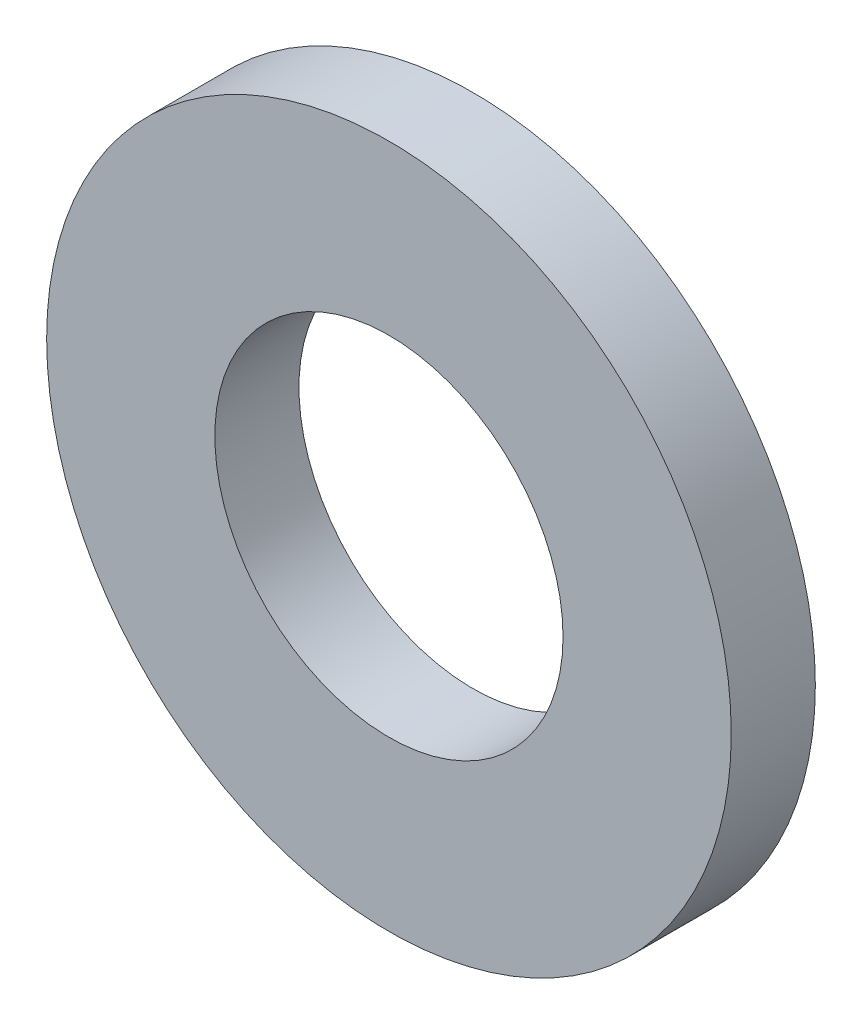
ISO-10303-21;
HEADER;
FILE_DESCRIPTION(('STEP AP214'),'2;1');
FILE_NAME('part.step','',(''),(''),'','','');
FILE_SCHEMA(('AUTOMOTIVE_DESIGN { 1 0 10303 214 1 1 1 1 }'));
ENDSEC;
DATA;
#1=APPLICATION_CONTEXT('core data for automotive mechanical design processes');
#2=APPLICATION_PROTOCOL_DEFINITION('international standard','automotive_design',2000,#1);
#3=PRODUCT_CONTEXT('',#1,'mechanical');
#4=PRODUCT('Part','Part','',(#3));
#5=PRODUCT_RELATED_PRODUCT_CATEGORY('part','',(#4));
#6=PRODUCT_DEFINITION_FORMATION('','',#4);
#7=PRODUCT_DEFINITION_CONTEXT('part definition',#1,'design');
#8=PRODUCT_DEFINITION('design','',#6,#7);
#9=PRODUCT_DEFINITION_SHAPE('','',#8);
#10=(LENGTH_UNIT() NAMED_UNIT(*) SI_UNIT(.MILLI.,.METRE.));
#11=(NAMED_UNIT(*) PLANE_ANGLE_UNIT() SI_UNIT($,.RADIAN.));
#12=(NAMED_UNIT(*) SI_UNIT($,.STERADIAN.) SOLID_ANGLE_UNIT());
#13=UNCERTAINTY_MEASURE_WITH_UNIT(LENGTH_MEASURE(1.E-05),#10,'distance_accuracy_value','');
#14=(GEOMETRIC_REPRESENTATION_CONTEXT(3) GLOBAL_UNCERTAINTY_ASSIGNED_CONTEXT((#13)) GLOBAL_UNIT_ASSIGNED_CONTEXT((#10,
#11,#12)) REPRESENTATION_CONTEXT('',''));
#15=CARTESIAN_POINT('',(0.,0.,0.));
#16=DIRECTION('',(0.,0.,1.));
#17=DIRECTION('',(1.,0.,0.));
#18=AXIS2_PLACEMENT_3D('',#15,#16,#17);
#19=CARTESIAN_POINT('',(0.,0.,5.));
#20=DIRECTION('',(0.,0.,1.));
#21=DIRECTION('',(1.,0.,0.));
#22=AXIS2_PLACEMENT_3D('',#19,#20,#21);
#23=PLANE('',#22);
#24=CARTESIAN_POINT('',(0.,0.,5.));
#25=DIRECTION('',(0.,0.,1.));
#26=DIRECTION('',(1.,0.,0.));
#27=AXIS2_PLACEMENT_3D('',#24,#25,#26);
#28=CIRCLE('',#27,20.35);
#29=CARTESIAN_POINT('',(20.35,0.,5.));
#30=VERTEX_POINT('',#29);
#31=EDGE_CURVE('E10',#30,#30,#28,.T.);
#32=ORIENTED_EDGE('',*,*,#31,.T.);
#33=EDGE_LOOP('',(#32));
#34=FACE_BOUND('',#33,.T.);
#35=CARTESIAN_POINT('',(0.,0.,5.));
#36=DIRECTION('',(0.,0.,1.));
#37=DIRECTION('',(1.,0.,0.));
#38=AXIS2_PLACEMENT_3D('',#35,#36,#37);
#39=CIRCLE('',#38,10.35);
#40=CARTESIAN_POINT('',(10.35,0.,5.));
#41=VERTEX_POINT('',#40);
#42=EDGE_CURVE('E42',#41,#41,#39,.T.);
#43=ORIENTED_EDGE('',*,*,#42,.F.);
#44=EDGE_LOOP('',(#43));
#45=FACE_BOUND('',#44,.T.);
#46=ADVANCED_FACE('F31',(#34,#45),#23,.T.);
#47=CARTESIAN_POINT('',(0.,0.,0.));
#48=DIRECTION('',(0.,0.,1.));
#49=DIRECTION('',(1.,0.,0.));
#50=AXIS2_PLACEMENT_3D('',#47,#48,#49);
#51=PLANE('',#50);
#52=CARTESIAN_POINT('',(0.,0.,0.));
#53=DIRECTION('',(0.,0.,1.));
#54=DIRECTION('',(1.,0.,0.));
#55=AXIS2_PLACEMENT_3D('',#52,#53,#54);
#56=CIRCLE('',#55,20.35);
#57=CARTESIAN_POINT('',(20.35,0.,0.));
#58=VERTEX_POINT('',#57);
#59=EDGE_CURVE('E35',#58,#58,#56,.T.);
#60=ORIENTED_EDGE('',*,*,#59,.F.);
#61=EDGE_LOOP('',(#60));
#62=FACE_BOUND('',#61,.T.);
#63=CARTESIAN_POINT('',(0.,0.,0.));
#64=DIRECTION('',(0.,0.,1.));
#65=DIRECTION('',(1.,0.,0.));
#66=AXIS2_PLACEMENT_3D('',#63,#64,#65);
#67=CIRCLE('',#66,10.35);
#68=CARTESIAN_POINT('',(10.35,0.,0.));
#69=VERTEX_POINT('',#68);
#70=EDGE_CURVE('E44',#69,#69,#67,.T.);
#71=ORIENTED_EDGE('',*,*,#70,.T.);
#72=EDGE_LOOP('',(#71));
#73=FACE_BOUND('',#72,.T.);
#74=ADVANCED_FACE('F54',(#62,#73),#51,.F.);
#75=CARTESIAN_POINT('',(0.,0.,5.));
#76=DIRECTION('',(0.,0.,-1.));
#77=DIRECTION('',(-1.,0.,0.));
#78=AXIS2_PLACEMENT_3D('',#75,#76,#77);
#79=CYLINDRICAL_SURFACE('',#78,20.35);
#80=ORIENTED_EDGE('',*,*,#31,.F.);
#81=EDGE_LOOP('',(#80));
#82=FACE_BOUND('',#81,.T.);
#83=ORIENTED_EDGE('',*,*,#59,.T.);
#84=EDGE_LOOP('',(#83));
#85=FACE_BOUND('',#84,.T.);
#86=ADVANCED_FACE('F33',(#82,#85),#79,.T.);
#87=CARTESIAN_POINT('',(0.,0.,5.));
#88=DIRECTION('',(0.,0.,-1.));
#89=DIRECTION('',(-1.,0.,0.));
#90=AXIS2_PLACEMENT_3D('',#87,#88,#89);
#91=CYLINDRICAL_SURFACE('',#90,10.35);
#92=ORIENTED_EDGE('',*,*,#42,.T.);
#93=EDGE_LOOP('',(#92));
#94=FACE_BOUND('',#93,.T.);
#95=ORIENTED_EDGE('',*,*,#70,.F.);
#96=EDGE_LOOP('',(#95));
#97=FACE_BOUND('',#96,.T.);
#98=ADVANCED_FACE('F50',(#94,#97),#91,.F.);
#99=CLOSED_SHELL('',(#46,#74,#86,#98));
#100=MANIFOLD_SOLID_BREP('B2',#99);
#101=ADVANCED_BREP_SHAPE_REPRESENTATION('',(#18,#100),#14);
#102=SHAPE_DEFINITION_REPRESENTATION(#9,#101);
ENDSEC;
END-ISO-10303-21;
